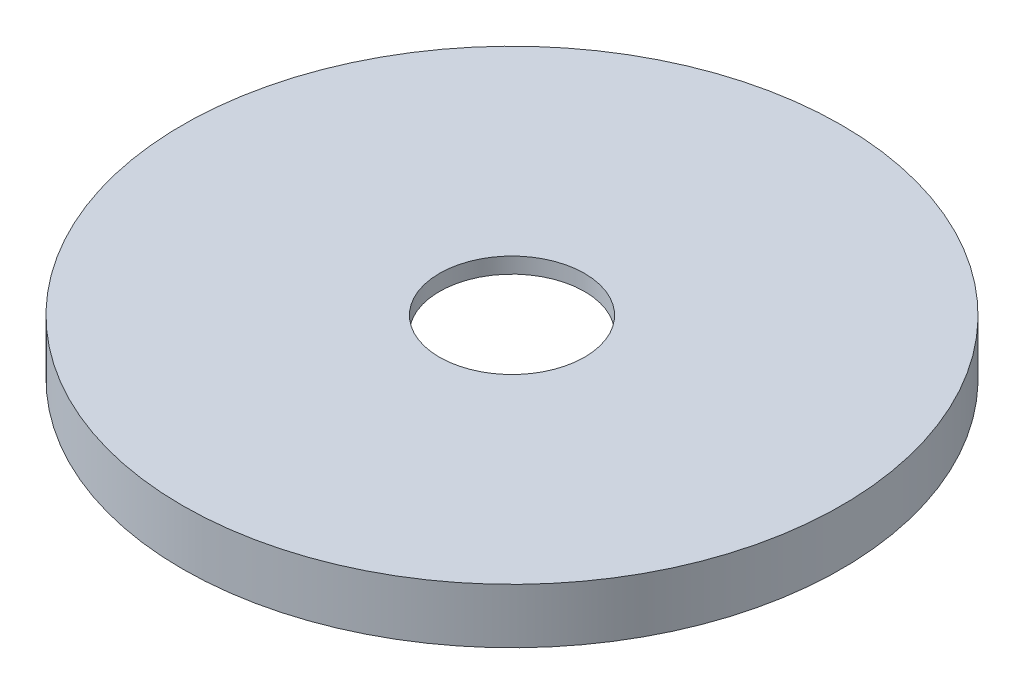
ISO-10303-21;
HEADER;
FILE_DESCRIPTION(('STEP AP214'),'2;1');
FILE_NAME('part.step','',(''),(''),'','','');
FILE_SCHEMA(('AUTOMOTIVE_DESIGN { 1 0 10303 214 1 1 1 1 }'));
ENDSEC;
DATA;
#1=APPLICATION_CONTEXT('core data for automotive mechanical design processes');
#2=APPLICATION_PROTOCOL_DEFINITION('international standard','automotive_design',2000,#1);
#3=PRODUCT_CONTEXT('',#1,'mechanical');
#4=PRODUCT('Part','Part','',(#3));
#5=PRODUCT_RELATED_PRODUCT_CATEGORY('part','',(#4));
#6=PRODUCT_DEFINITION_FORMATION('','',#4);
#7=PRODUCT_DEFINITION_CONTEXT('part definition',#1,'design');
#8=PRODUCT_DEFINITION('design','',#6,#7);
#9=PRODUCT_DEFINITION_SHAPE('','',#8);
#10=(LENGTH_UNIT() NAMED_UNIT(*) SI_UNIT(.MILLI.,.METRE.));
#11=(NAMED_UNIT(*) PLANE_ANGLE_UNIT() SI_UNIT($,.RADIAN.));
#12=(NAMED_UNIT(*) SI_UNIT($,.STERADIAN.) SOLID_ANGLE_UNIT());
#13=UNCERTAINTY_MEASURE_WITH_UNIT(LENGTH_MEASURE(1.E-05),#10,'distance_accuracy_value','');
#14=(GEOMETRIC_REPRESENTATION_CONTEXT(3) GLOBAL_UNCERTAINTY_ASSIGNED_CONTEXT((#13)) GLOBAL_UNIT_ASSIGNED_CONTEXT((#10,
#11,#12)) REPRESENTATION_CONTEXT('',''));
#15=CARTESIAN_POINT('',(0.,0.,0.));
#16=DIRECTION('',(0.,0.,1.));
#17=DIRECTION('',(1.,0.,0.));
#18=AXIS2_PLACEMENT_3D('',#15,#16,#17);
#19=CARTESIAN_POINT('',(0.,10.,0.));
#20=DIRECTION('',(0.,-1.,0.));
#21=DIRECTION('',(0.,0.,-1.));
#22=AXIS2_PLACEMENT_3D('',#19,#20,#21);
#23=CYLINDRICAL_SURFACE('',#22,82.);
#24=CARTESIAN_POINT('',(0.,10.,0.));
#25=DIRECTION('',(0.,1.,0.));
#26=DIRECTION('',(0.,0.,1.));
#27=AXIS2_PLACEMENT_3D('',#24,#25,#26);
#28=CIRCLE('',#27,82.);
#29=CARTESIAN_POINT('',(0.,10.,82.));
#30=VERTEX_POINT('',#29);
#31=EDGE_CURVE('E71',#30,#30,#28,.T.);
#32=ORIENTED_EDGE('',*,*,#31,.T.);
#33=EDGE_LOOP('',(#32));
#34=FACE_BOUND('',#33,.T.);
#35=CARTESIAN_POINT('',(0.,5.,0.));
#36=DIRECTION('',(0.,-1.,0.));
#37=DIRECTION('',(0.,0.,-1.));
#38=AXIS2_PLACEMENT_3D('',#35,#36,#37);
#39=CIRCLE('',#38,82.);
#40=CARTESIAN_POINT('',(0.,5.,-82.));
#41=VERTEX_POINT('',#40);
#42=EDGE_CURVE('E100',#41,#41,#39,.T.);
#43=ORIENTED_EDGE('',*,*,#42,.T.);
#44=EDGE_LOOP('',(#43));
#45=FACE_BOUND('',#44,.T.);
#46=ADVANCED_FACE('F43',(#34,#45),#23,.F.);
#47=CARTESIAN_POINT('',(0.,10.,0.));
#48=DIRECTION('',(0.,1.,0.));
#49=DIRECTION('',(0.,0.,1.));
#50=AXIS2_PLACEMENT_3D('',#47,#48,#49);
#51=PLANE('',#50);
#52=CARTESIAN_POINT('',(0.,10.,0.));
#53=DIRECTION('',(0.,-1.,0.));
#54=DIRECTION('',(0.,0.,-1.));
#55=AXIS2_PLACEMENT_3D('',#52,#53,#54);
#56=CIRCLE('',#55,18.5);
#57=CARTESIAN_POINT('',(0.,10.,-18.5));
#58=VERTEX_POINT('',#57);
#59=EDGE_CURVE('E107',#58,#58,#56,.T.);
#60=ORIENTED_EDGE('',*,*,#59,.F.);
#61=EDGE_LOOP('',(#60));
#62=FACE_BOUND('',#61,.T.);
#63=CARTESIAN_POINT('',(40.0000000000001,10.,19.9999999999999));
#64=DIRECTION('',(0.,1.,0.));
#65=DIRECTION('',(0.,0.,1.));
#66=AXIS2_PLACEMENT_3D('',#63,#64,#65);
#67=CIRCLE('',#66,1.5);
#68=CARTESIAN_POINT('',(40.0000000000001,10.,21.4999999999999));
#69=VERTEX_POINT('',#68);
#70=EDGE_CURVE('E10',#69,#69,#67,.F.);
#71=ORIENTED_EDGE('',*,*,#70,.F.);
#72=EDGE_LOOP('',(#71));
#73=FACE_BOUND('',#72,.T.);
#74=CARTESIAN_POINT('',(20.,10.,-40.));
#75=DIRECTION('',(0.,1.,0.));
#76=DIRECTION('',(0.,0.,1.));
#77=AXIS2_PLACEMENT_3D('',#74,#75,#76);
#78=CIRCLE('',#77,1.5);
#79=CARTESIAN_POINT('',(20.,10.,-38.5));
#80=VERTEX_POINT('',#79);
#81=EDGE_CURVE('E52',#80,#80,#78,.F.);
#82=ORIENTED_EDGE('',*,*,#81,.F.);
#83=EDGE_LOOP('',(#82));
#84=FACE_BOUND('',#83,.T.);
#85=CARTESIAN_POINT('',(-40.0000000000002,10.,-19.9999999999996));
#86=DIRECTION('',(0.,1.,0.));
#87=DIRECTION('',(0.,0.,1.));
#88=AXIS2_PLACEMENT_3D('',#85,#86,#87);
#89=CIRCLE('',#88,1.5);
#90=CARTESIAN_POINT('',(-40.0000000000002,10.,-18.4999999999996));
#91=VERTEX_POINT('',#90);
#92=EDGE_CURVE('E57',#91,#91,#89,.F.);
#93=ORIENTED_EDGE('',*,*,#92,.F.);
#94=EDGE_LOOP('',(#93));
#95=FACE_BOUND('',#94,.T.);
#96=CARTESIAN_POINT('',(-20.,10.,40.));
#97=DIRECTION('',(0.,1.,0.));
#98=DIRECTION('',(0.,0.,1.));
#99=AXIS2_PLACEMENT_3D('',#96,#97,#98);
#100=CIRCLE('',#99,1.5);
#101=CARTESIAN_POINT('',(-20.,10.,41.5));
#102=VERTEX_POINT('',#101);
#103=EDGE_CURVE('E63',#102,#102,#100,.F.);
#104=ORIENTED_EDGE('',*,*,#103,.F.);
#105=EDGE_LOOP('',(#104));
#106=FACE_BOUND('',#105,.T.);
#107=ORIENTED_EDGE('',*,*,#31,.F.);
#108=EDGE_LOOP('',(#107));
#109=FACE_BOUND('',#108,.T.);
#110=ADVANCED_FACE('F134',(#62,#73,#84,#95,#106,#109),#51,.F.);
#111=CARTESIAN_POINT('',(-20.,0.,40.));
#112=DIRECTION('',(0.,1.,0.));
#113=DIRECTION('',(0.,0.,1.));
#114=AXIS2_PLACEMENT_3D('',#111,#112,#113);
#115=CYLINDRICAL_SURFACE('',#114,1.5);
#116=CARTESIAN_POINT('',(-20.,0.,40.));
#117=DIRECTION('',(0.,-1.,0.));
#118=DIRECTION('',(0.,0.,-1.));
#119=AXIS2_PLACEMENT_3D('',#116,#117,#118);
#120=CIRCLE('',#119,1.5);
#121=CARTESIAN_POINT('',(-20.,0.,38.5));
#122=VERTEX_POINT('',#121);
#123=EDGE_CURVE('E79',#122,#122,#120,.T.);
#124=ORIENTED_EDGE('',*,*,#123,.F.);
#125=EDGE_LOOP('',(#124));
#126=FACE_BOUND('',#125,.T.);
#127=ORIENTED_EDGE('',*,*,#103,.T.);
#128=EDGE_LOOP('',(#127));
#129=FACE_BOUND('',#128,.T.);
#130=ADVANCED_FACE('F142',(#126,#129),#115,.T.);
#131=CARTESIAN_POINT('',(-20.,0.,40.));
#132=DIRECTION('',(0.,-1.,0.));
#133=DIRECTION('',(0.,0.,-1.));
#134=AXIS2_PLACEMENT_3D('',#131,#132,#133);
#135=PLANE('',#134);
#136=ORIENTED_EDGE('',*,*,#123,.T.);
#137=EDGE_LOOP('',(#136));
#138=FACE_BOUND('',#137,.T.);
#139=ADVANCED_FACE('F148',(#138),#135,.T.);
#140=CARTESIAN_POINT('',(-40.0000000000002,0.,-19.9999999999996));
#141=DIRECTION('',(0.,1.,0.));
#142=DIRECTION('',(0.,0.,1.));
#143=AXIS2_PLACEMENT_3D('',#140,#141,#142);
#144=CYLINDRICAL_SURFACE('',#143,1.5);
#145=CARTESIAN_POINT('',(-40.0000000000002,0.,-19.9999999999996));
#146=DIRECTION('',(0.,-1.,0.));
#147=DIRECTION('',(1.,0.,0.));
#148=AXIS2_PLACEMENT_3D('',#145,#146,#147);
#149=CIRCLE('',#148,1.5);
#150=CARTESIAN_POINT('',(-38.5000000000002,0.,-19.9999999999996));
#151=VERTEX_POINT('',#150);
#152=EDGE_CURVE('E84',#151,#151,#149,.T.);
#153=ORIENTED_EDGE('',*,*,#152,.F.);
#154=EDGE_LOOP('',(#153));
#155=FACE_BOUND('',#154,.T.);
#156=ORIENTED_EDGE('',*,*,#92,.T.);
#157=EDGE_LOOP('',(#156));
#158=FACE_BOUND('',#157,.T.);
#159=ADVANCED_FACE('F152',(#155,#158),#144,.T.);
#160=CARTESIAN_POINT('',(-40.0000000000002,0.,-19.9999999999996));
#161=DIRECTION('',(0.,-1.,0.));
#162=DIRECTION('',(1.,0.,0.));
#163=AXIS2_PLACEMENT_3D('',#160,#161,#162);
#164=PLANE('',#163);
#165=ORIENTED_EDGE('',*,*,#152,.T.);
#166=EDGE_LOOP('',(#165));
#167=FACE_BOUND('',#166,.T.);
#168=ADVANCED_FACE('F156',(#167),#164,.T.);
#169=CARTESIAN_POINT('',(20.,0.,-40.));
#170=DIRECTION('',(0.,1.,0.));
#171=DIRECTION('',(0.,0.,1.));
#172=AXIS2_PLACEMENT_3D('',#169,#170,#171);
#173=CYLINDRICAL_SURFACE('',#172,1.5);
#174=CARTESIAN_POINT('',(20.,0.,-40.));
#175=DIRECTION('',(0.,-1.,0.));
#176=DIRECTION('',(0.,0.,1.));
#177=AXIS2_PLACEMENT_3D('',#174,#175,#176);
#178=CIRCLE('',#177,1.5);
#179=CARTESIAN_POINT('',(20.,0.,-38.5));
#180=VERTEX_POINT('',#179);
#181=EDGE_CURVE('E88',#180,#180,#178,.T.);
#182=ORIENTED_EDGE('',*,*,#181,.F.);
#183=EDGE_LOOP('',(#182));
#184=FACE_BOUND('',#183,.T.);
#185=ORIENTED_EDGE('',*,*,#81,.T.);
#186=EDGE_LOOP('',(#185));
#187=FACE_BOUND('',#186,.T.);
#188=ADVANCED_FACE('F160',(#184,#187),#173,.T.);
#189=CARTESIAN_POINT('',(20.,0.,-40.));
#190=DIRECTION('',(0.,-1.,0.));
#191=DIRECTION('',(0.,0.,1.));
#192=AXIS2_PLACEMENT_3D('',#189,#190,#191);
#193=PLANE('',#192);
#194=ORIENTED_EDGE('',*,*,#181,.T.);
#195=EDGE_LOOP('',(#194));
#196=FACE_BOUND('',#195,.T.);
#197=ADVANCED_FACE('F164',(#196),#193,.T.);
#198=CARTESIAN_POINT('',(40.0000000000001,0.,19.9999999999999));
#199=DIRECTION('',(0.,1.,0.));
#200=DIRECTION('',(0.,0.,1.));
#201=AXIS2_PLACEMENT_3D('',#198,#199,#200);
#202=CYLINDRICAL_SURFACE('',#201,1.5);
#203=CARTESIAN_POINT('',(40.0000000000001,0.,19.9999999999999));
#204=DIRECTION('',(0.,-1.,0.));
#205=DIRECTION('',(-1.,0.,0.));
#206=AXIS2_PLACEMENT_3D('',#203,#204,#205);
#207=CIRCLE('',#206,1.5);
#208=CARTESIAN_POINT('',(38.5000000000001,0.,19.9999999999999));
#209=VERTEX_POINT('',#208);
#210=EDGE_CURVE('E83',#209,#209,#207,.T.);
#211=ORIENTED_EDGE('',*,*,#210,.F.);
#212=EDGE_LOOP('',(#211));
#213=FACE_BOUND('',#212,.T.);
#214=ORIENTED_EDGE('',*,*,#70,.T.);
#215=EDGE_LOOP('',(#214));
#216=FACE_BOUND('',#215,.T.);
#217=ADVANCED_FACE('F168',(#213,#216),#202,.T.);
#218=CARTESIAN_POINT('',(40.0000000000001,0.,19.9999999999999));
#219=DIRECTION('',(0.,-1.,0.));
#220=DIRECTION('',(-1.,0.,0.));
#221=AXIS2_PLACEMENT_3D('',#218,#219,#220);
#222=PLANE('',#221);
#223=ORIENTED_EDGE('',*,*,#210,.T.);
#224=EDGE_LOOP('',(#223));
#225=FACE_BOUND('',#224,.T.);
#226=ADVANCED_FACE('F172',(#225),#222,.T.);
#227=CARTESIAN_POINT('',(0.,5.,0.));
#228=DIRECTION('',(0.,-1.,0.));
#229=DIRECTION('',(0.,0.,-1.));
#230=AXIS2_PLACEMENT_3D('',#227,#228,#229);
#231=CYLINDRICAL_SURFACE('',#230,83.);
#232=CARTESIAN_POINT('',(0.,5.,0.));
#233=DIRECTION('',(0.,-1.,0.));
#234=DIRECTION('',(0.,0.,-1.));
#235=AXIS2_PLACEMENT_3D('',#232,#233,#234);
#236=CIRCLE('',#235,83.);
#237=CARTESIAN_POINT('',(0.,5.,-83.));
#238=VERTEX_POINT('',#237);
#239=EDGE_CURVE('E89',#238,#238,#236,.T.);
#240=ORIENTED_EDGE('',*,*,#239,.F.);
#241=EDGE_LOOP('',(#240));
#242=FACE_BOUND('',#241,.T.);
#243=CARTESIAN_POINT('',(0.,0.,0.));
#244=DIRECTION('',(0.,-1.,0.));
#245=DIRECTION('',(0.,0.,-1.));
#246=AXIS2_PLACEMENT_3D('',#243,#244,#245);
#247=CIRCLE('',#246,83.);
#248=CARTESIAN_POINT('',(0.,0.,-83.));
#249=VERTEX_POINT('',#248);
#250=EDGE_CURVE('E96',#249,#249,#247,.T.);
#251=ORIENTED_EDGE('',*,*,#250,.T.);
#252=EDGE_LOOP('',(#251));
#253=FACE_BOUND('',#252,.T.);
#254=ADVANCED_FACE('F175',(#242,#253),#231,.F.);
#255=CARTESIAN_POINT('',(0.,5.,0.));
#256=DIRECTION('',(0.,-1.,0.));
#257=DIRECTION('',(0.,0.,-1.));
#258=AXIS2_PLACEMENT_3D('',#255,#256,#257);
#259=PLANE('',#258);
#260=ORIENTED_EDGE('',*,*,#42,.F.);
#261=EDGE_LOOP('',(#260));
#262=FACE_BOUND('',#261,.T.);
#263=ORIENTED_EDGE('',*,*,#239,.T.);
#264=EDGE_LOOP('',(#263));
#265=FACE_BOUND('',#264,.T.);
#266=ADVANCED_FACE('F121',(#262,#265),#259,.T.);
#267=CARTESIAN_POINT('',(0.,14.,0.));
#268=DIRECTION('',(0.,1.,0.));
#269=DIRECTION('',(0.,0.,1.));
#270=AXIS2_PLACEMENT_3D('',#267,#268,#269);
#271=PLANE('',#270);
#272=CARTESIAN_POINT('',(0.,14.,0.));
#273=DIRECTION('',(0.,1.,0.));
#274=DIRECTION('',(0.,0.,1.));
#275=AXIS2_PLACEMENT_3D('',#272,#273,#274);
#276=CIRCLE('',#275,18.5);
#277=CARTESIAN_POINT('',(0.,14.,18.5));
#278=VERTEX_POINT('',#277);
#279=EDGE_CURVE('E47',#278,#278,#276,.T.);
#280=ORIENTED_EDGE('',*,*,#279,.F.);
#281=EDGE_LOOP('',(#280));
#282=FACE_BOUND('',#281,.T.);
#283=CARTESIAN_POINT('',(0.,14.,0.));
#284=DIRECTION('',(0.,1.,0.));
#285=DIRECTION('',(0.,0.,1.));
#286=AXIS2_PLACEMENT_3D('',#283,#284,#285);
#287=CIRCLE('',#286,84.);
#288=CARTESIAN_POINT('',(0.,14.,84.));
#289=VERTEX_POINT('',#288);
#290=EDGE_CURVE('E75',#289,#289,#287,.T.);
#291=ORIENTED_EDGE('',*,*,#290,.T.);
#292=EDGE_LOOP('',(#291));
#293=FACE_BOUND('',#292,.T.);
#294=ADVANCED_FACE('F118',(#282,#293),#271,.T.);
#295=CARTESIAN_POINT('',(0.,10.,0.));
#296=DIRECTION('',(0.,-1.,0.));
#297=DIRECTION('',(0.,0.,-1.));
#298=AXIS2_PLACEMENT_3D('',#295,#296,#297);
#299=CYLINDRICAL_SURFACE('',#298,84.);
#300=CARTESIAN_POINT('',(0.,0.,0.));
#301=DIRECTION('',(0.,1.,0.));
#302=DIRECTION('',(0.,0.,1.));
#303=AXIS2_PLACEMENT_3D('',#300,#301,#302);
#304=CIRCLE('',#303,84.);
#305=CARTESIAN_POINT('',(0.,0.,84.));
#306=VERTEX_POINT('',#305);
#307=EDGE_CURVE('E67',#306,#306,#304,.T.);
#308=ORIENTED_EDGE('',*,*,#307,.T.);
#309=EDGE_LOOP('',(#308));
#310=FACE_BOUND('',#309,.T.);
#311=ORIENTED_EDGE('',*,*,#290,.F.);
#312=EDGE_LOOP('',(#311));
#313=FACE_BOUND('',#312,.T.);
#314=ADVANCED_FACE('F45',(#310,#313),#299,.T.);
#315=CARTESIAN_POINT('',(0.,0.,0.));
#316=DIRECTION('',(0.,1.,0.));
#317=DIRECTION('',(0.,0.,1.));
#318=AXIS2_PLACEMENT_3D('',#315,#316,#317);
#319=PLANE('',#318);
#320=ORIENTED_EDGE('',*,*,#250,.F.);
#321=EDGE_LOOP('',(#320));
#322=FACE_BOUND('',#321,.T.);
#323=ORIENTED_EDGE('',*,*,#307,.F.);
#324=EDGE_LOOP('',(#323));
#325=FACE_BOUND('',#324,.T.);
#326=ADVANCED_FACE('F126',(#322,#325),#319,.F.);
#327=CARTESIAN_POINT('',(0.,23.,0.));
#328=DIRECTION('',(0.,-1.,0.));
#329=DIRECTION('',(0.,0.,-1.));
#330=AXIS2_PLACEMENT_3D('',#327,#328,#329);
#331=CYLINDRICAL_SURFACE('',#330,18.5);
#332=ORIENTED_EDGE('',*,*,#279,.T.);
#333=EDGE_LOOP('',(#332));
#334=FACE_BOUND('',#333,.T.);
#335=ORIENTED_EDGE('',*,*,#59,.T.);
#336=EDGE_LOOP('',(#335));
#337=FACE_BOUND('',#336,.T.);
#338=ADVANCED_FACE('F116',(#334,#337),#331,.F.);
#339=CLOSED_SHELL('',(#46,#110,#130,#139,#159,#168,#188,#197,#217,#226,#254,#266,#294,#314,#326,#338));
#340=MANIFOLD_SOLID_BREP('B2',#339);
#341=ADVANCED_BREP_SHAPE_REPRESENTATION('',(#18,#340),#14);
#342=SHAPE_DEFINITION_REPRESENTATION(#9,#341);
ENDSEC;
END-ISO-10303-21;
